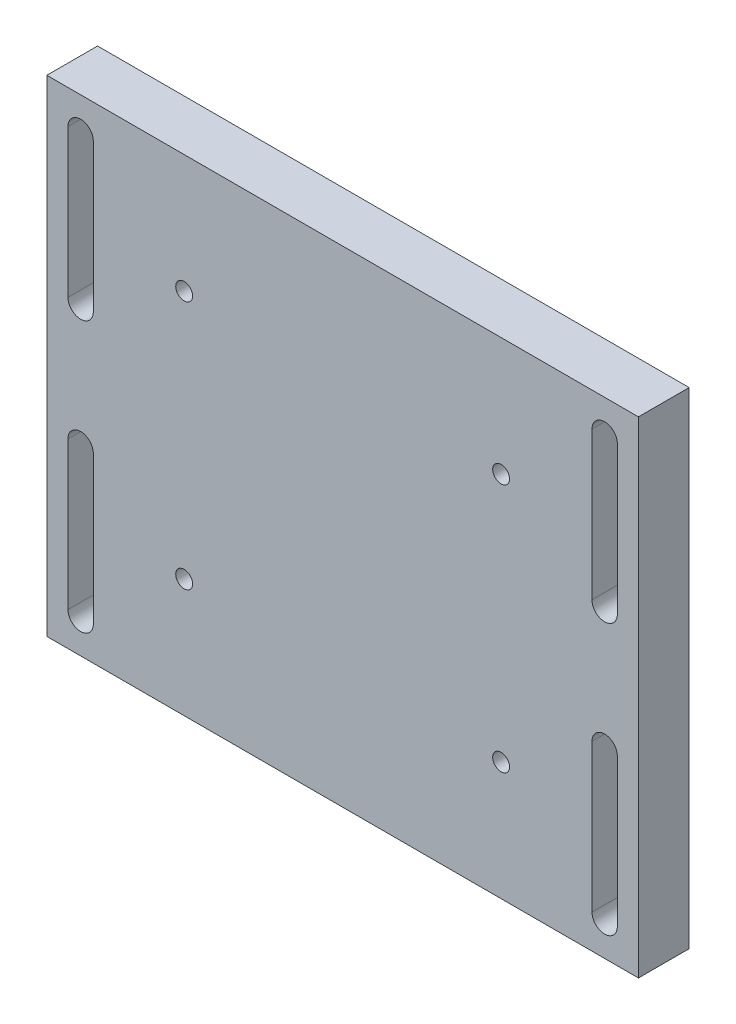
ISO-10303-21;
HEADER;
FILE_DESCRIPTION(('STEP AP214'),'2;1');
FILE_NAME('part.step','',(''),(''),'','','');
FILE_SCHEMA(('AUTOMOTIVE_DESIGN { 1 0 10303 214 1 1 1 1 }'));
ENDSEC;
DATA;
#1=APPLICATION_CONTEXT('core data for automotive mechanical design processes');
#2=APPLICATION_PROTOCOL_DEFINITION('international standard','automotive_design',2000,#1);
#3=PRODUCT_CONTEXT('',#1,'mechanical');
#4=PRODUCT('Part','Part','',(#3));
#5=PRODUCT_RELATED_PRODUCT_CATEGORY('part','',(#4));
#6=PRODUCT_DEFINITION_FORMATION('','',#4);
#7=PRODUCT_DEFINITION_CONTEXT('part definition',#1,'design');
#8=PRODUCT_DEFINITION('design','',#6,#7);
#9=PRODUCT_DEFINITION_SHAPE('','',#8);
#10=(LENGTH_UNIT() NAMED_UNIT(*) SI_UNIT(.MILLI.,.METRE.));
#11=(NAMED_UNIT(*) PLANE_ANGLE_UNIT() SI_UNIT($,.RADIAN.));
#12=(NAMED_UNIT(*) SI_UNIT($,.STERADIAN.) SOLID_ANGLE_UNIT());
#13=UNCERTAINTY_MEASURE_WITH_UNIT(LENGTH_MEASURE(1.E-05),#10,'distance_accuracy_value','');
#14=(GEOMETRIC_REPRESENTATION_CONTEXT(3) GLOBAL_UNCERTAINTY_ASSIGNED_CONTEXT((#13)) GLOBAL_UNIT_ASSIGNED_CONTEXT((#10,
#11,#12)) REPRESENTATION_CONTEXT('',''));
#15=CARTESIAN_POINT('',(0.,0.,0.));
#16=DIRECTION('',(0.,0.,1.));
#17=DIRECTION('',(1.,0.,0.));
#18=AXIS2_PLACEMENT_3D('',#15,#16,#17);
#19=CARTESIAN_POINT('',(70.,57.5,6.));
#20=DIRECTION('',(-1.,0.,0.));
#21=DIRECTION('',(0.,-1.,0.));
#22=AXIS2_PLACEMENT_3D('',#19,#20,#21);
#23=PLANE('',#22);
#24=DIRECTION('',(0.,1.,0.));
#25=VECTOR('',#24,1.);
#26=CARTESIAN_POINT('',(70.,57.5,-6.));
#27=LINE('',#26,#25);
#28=CARTESIAN_POINT('',(70.,-57.5,-6.));
#29=VERTEX_POINT('',#28);
#30=CARTESIAN_POINT('',(70.,57.5,-6.));
#31=VERTEX_POINT('',#30);
#32=EDGE_CURVE('E311',#29,#31,#27,.T.);
#33=ORIENTED_EDGE('',*,*,#32,.T.);
#34=DIRECTION('',(0.,0.,-1.));
#35=VECTOR('',#34,1.);
#36=CARTESIAN_POINT('',(70.,57.5,6.));
#37=LINE('',#36,#35);
#38=CARTESIAN_POINT('',(70.,57.5,6.));
#39=VERTEX_POINT('',#38);
#40=EDGE_CURVE('E11',#39,#31,#37,.T.);
#41=ORIENTED_EDGE('',*,*,#40,.F.);
#42=DIRECTION('',(0.,1.,0.));
#43=VECTOR('',#42,1.);
#44=CARTESIAN_POINT('',(70.,57.5,6.));
#45=LINE('',#44,#43);
#46=CARTESIAN_POINT('',(70.,-57.5,6.));
#47=VERTEX_POINT('',#46);
#48=EDGE_CURVE('E312',#47,#39,#45,.T.);
#49=ORIENTED_EDGE('',*,*,#48,.F.);
#50=DIRECTION('',(0.,0.,-1.));
#51=VECTOR('',#50,1.);
#52=CARTESIAN_POINT('',(70.,-57.5,6.));
#53=LINE('',#52,#51);
#54=EDGE_CURVE('E322',#47,#29,#53,.T.);
#55=ORIENTED_EDGE('',*,*,#54,.T.);
#56=EDGE_LOOP('',(#33,#41,#49,#55));
#57=FACE_BOUND('',#56,.T.);
#58=ADVANCED_FACE('F33',(#57),#23,.F.);
#59=CARTESIAN_POINT('',(-70.,57.5,6.));
#60=DIRECTION('',(0.,-1.,0.));
#61=DIRECTION('',(0.,0.,-1.));
#62=AXIS2_PLACEMENT_3D('',#59,#60,#61);
#63=PLANE('',#62);
#64=DIRECTION('',(-1.,0.,0.));
#65=VECTOR('',#64,1.);
#66=CARTESIAN_POINT('',(-70.,57.5,-6.));
#67=LINE('',#66,#65);
#68=CARTESIAN_POINT('',(-70.,57.5,-6.));
#69=VERTEX_POINT('',#68);
#70=EDGE_CURVE('E325',#31,#69,#67,.T.);
#71=ORIENTED_EDGE('',*,*,#70,.T.);
#72=DIRECTION('',(0.,0.,-1.));
#73=VECTOR('',#72,1.);
#74=CARTESIAN_POINT('',(-70.,57.5,6.));
#75=LINE('',#74,#73);
#76=CARTESIAN_POINT('',(-70.,57.5,6.));
#77=VERTEX_POINT('',#76);
#78=EDGE_CURVE('E40',#77,#69,#75,.T.);
#79=ORIENTED_EDGE('',*,*,#78,.F.);
#80=DIRECTION('',(-1.,0.,0.));
#81=VECTOR('',#80,1.);
#82=CARTESIAN_POINT('',(-70.,57.5,6.));
#83=LINE('',#82,#81);
#84=EDGE_CURVE('E315',#39,#77,#83,.T.);
#85=ORIENTED_EDGE('',*,*,#84,.F.);
#86=ORIENTED_EDGE('',*,*,#40,.T.);
#87=EDGE_LOOP('',(#71,#79,#85,#86));
#88=FACE_BOUND('',#87,.T.);
#89=ADVANCED_FACE('F354',(#88),#63,.F.);
#90=CARTESIAN_POINT('',(-70.,57.5,6.));
#91=DIRECTION('',(1.,0.,0.));
#92=DIRECTION('',(0.,1.,0.));
#93=AXIS2_PLACEMENT_3D('',#90,#91,#92);
#94=PLANE('',#93);
#95=DIRECTION('',(0.,-1.,0.));
#96=VECTOR('',#95,1.);
#97=CARTESIAN_POINT('',(-70.,57.5,-6.));
#98=LINE('',#97,#96);
#99=CARTESIAN_POINT('',(-70.,-57.5,-6.));
#100=VERTEX_POINT('',#99);
#101=EDGE_CURVE('E327',#69,#100,#98,.T.);
#102=ORIENTED_EDGE('',*,*,#101,.T.);
#103=DIRECTION('',(0.,0.,-1.));
#104=VECTOR('',#103,1.);
#105=CARTESIAN_POINT('',(-70.,-57.5,6.));
#106=LINE('',#105,#104);
#107=CARTESIAN_POINT('',(-70.,-57.5,6.));
#108=VERTEX_POINT('',#107);
#109=EDGE_CURVE('E332',#108,#100,#106,.T.);
#110=ORIENTED_EDGE('',*,*,#109,.F.);
#111=DIRECTION('',(0.,-1.,0.));
#112=VECTOR('',#111,1.);
#113=CARTESIAN_POINT('',(-70.,57.5,6.));
#114=LINE('',#113,#112);
#115=EDGE_CURVE('E318',#77,#108,#114,.T.);
#116=ORIENTED_EDGE('',*,*,#115,.F.);
#117=ORIENTED_EDGE('',*,*,#78,.T.);
#118=EDGE_LOOP('',(#102,#110,#116,#117));
#119=FACE_BOUND('',#118,.T.);
#120=ADVANCED_FACE('F339',(#119),#94,.F.);
#121=CARTESIAN_POINT('',(-70.,-57.5,6.));
#122=DIRECTION('',(0.,1.,0.));
#123=DIRECTION('',(0.,0.,1.));
#124=AXIS2_PLACEMENT_3D('',#121,#122,#123);
#125=PLANE('',#124);
#126=DIRECTION('',(1.,0.,0.));
#127=VECTOR('',#126,1.);
#128=CARTESIAN_POINT('',(-70.,-57.5,-6.));
#129=LINE('',#128,#127);
#130=EDGE_CURVE('E316',#100,#29,#129,.T.);
#131=ORIENTED_EDGE('',*,*,#130,.T.);
#132=ORIENTED_EDGE('',*,*,#54,.F.);
#133=DIRECTION('',(1.,0.,0.));
#134=VECTOR('',#133,1.);
#135=CARTESIAN_POINT('',(-70.,-57.5,6.));
#136=LINE('',#135,#134);
#137=EDGE_CURVE('E320',#108,#47,#136,.T.);
#138=ORIENTED_EDGE('',*,*,#137,.F.);
#139=ORIENTED_EDGE('',*,*,#109,.T.);
#140=EDGE_LOOP('',(#131,#132,#138,#139));
#141=FACE_BOUND('',#140,.T.);
#142=ADVANCED_FACE('F348',(#141),#125,.F.);
#143=CARTESIAN_POINT('',(0.,0.,6.));
#144=DIRECTION('',(0.,0.,1.));
#145=DIRECTION('',(1.,0.,0.));
#146=AXIS2_PLACEMENT_3D('',#143,#144,#145);
#147=PLANE('',#146);
#148=CARTESIAN_POINT('',(-37.5,29.5,6.));
#149=DIRECTION('',(0.,0.,-1.));
#150=DIRECTION('',(-1.,0.,0.));
#151=AXIS2_PLACEMENT_3D('',#148,#149,#150);
#152=CIRCLE('',#151,2.);
#153=CARTESIAN_POINT('',(-39.5,29.5,6.));
#154=VERTEX_POINT('',#153);
#155=EDGE_CURVE('E451',#154,#154,#152,.T.);
#156=ORIENTED_EDGE('',*,*,#155,.T.);
#157=EDGE_LOOP('',(#156));
#158=FACE_BOUND('',#157,.T.);
#159=CARTESIAN_POINT('',(-62.,14.5,6.));
#160=DIRECTION('',(0.,0.,-1.));
#161=DIRECTION('',(-1.,0.,0.));
#162=AXIS2_PLACEMENT_3D('',#159,#160,#161);
#163=CIRCLE('',#162,3.00000000000001);
#164=CARTESIAN_POINT('',(-59.,14.5,6.));
#165=VERTEX_POINT('',#164);
#166=CARTESIAN_POINT('',(-65.0000000000001,14.5,6.));
#167=VERTEX_POINT('',#166);
#168=EDGE_CURVE('E189',#165,#167,#163,.T.);
#169=ORIENTED_EDGE('',*,*,#168,.T.);
#170=DIRECTION('',(0.,1.,0.));
#171=VECTOR('',#170,1.);
#172=CARTESIAN_POINT('',(-65.0000000000001,49.5,6.));
#173=LINE('',#172,#171);
#174=CARTESIAN_POINT('',(-65.0000000000001,49.5,6.));
#175=VERTEX_POINT('',#174);
#176=EDGE_CURVE('E172',#167,#175,#173,.T.);
#177=ORIENTED_EDGE('',*,*,#176,.T.);
#178=CARTESIAN_POINT('',(-62.,49.5,6.));
#179=DIRECTION('',(0.,0.,-1.));
#180=DIRECTION('',(-1.,0.,0.));
#181=AXIS2_PLACEMENT_3D('',#178,#179,#180);
#182=CIRCLE('',#181,3.00000000000001);
#183=CARTESIAN_POINT('',(-59.,49.5,6.));
#184=VERTEX_POINT('',#183);
#185=EDGE_CURVE('E180',#175,#184,#182,.T.);
#186=ORIENTED_EDGE('',*,*,#185,.T.);
#187=DIRECTION('',(0.,-1.,0.));
#188=VECTOR('',#187,1.);
#189=CARTESIAN_POINT('',(-59.,14.5,6.));
#190=LINE('',#189,#188);
#191=EDGE_CURVE('E47',#184,#165,#190,.T.);
#192=ORIENTED_EDGE('',*,*,#191,.T.);
#193=EDGE_LOOP('',(#169,#177,#186,#192));
#194=FACE_BOUND('',#193,.T.);
#195=CARTESIAN_POINT('',(-37.5,-29.5,6.));
#196=DIRECTION('',(0.,0.,1.));
#197=DIRECTION('',(-1.,0.,0.));
#198=AXIS2_PLACEMENT_3D('',#195,#196,#197);
#199=CIRCLE('',#198,2.);
#200=CARTESIAN_POINT('',(-39.5,-29.5,6.));
#201=VERTEX_POINT('',#200);
#202=EDGE_CURVE('E201',#201,#201,#199,.T.);
#203=ORIENTED_EDGE('',*,*,#202,.F.);
#204=EDGE_LOOP('',(#203));
#205=FACE_BOUND('',#204,.T.);
#206=CARTESIAN_POINT('',(-62.,-49.5,6.));
#207=DIRECTION('',(0.,0.,1.));
#208=DIRECTION('',(-1.,0.,0.));
#209=AXIS2_PLACEMENT_3D('',#206,#207,#208);
#210=CIRCLE('',#209,3.00000000000001);
#211=CARTESIAN_POINT('',(-65.0000000000001,-49.5,6.));
#212=VERTEX_POINT('',#211);
#213=CARTESIAN_POINT('',(-59.,-49.5,6.));
#214=VERTEX_POINT('',#213);
#215=EDGE_CURVE('E208',#212,#214,#210,.T.);
#216=ORIENTED_EDGE('',*,*,#215,.F.);
#217=DIRECTION('',(0.,-1.,0.));
#218=VECTOR('',#217,1.);
#219=CARTESIAN_POINT('',(-65.0000000000001,-49.5,6.));
#220=LINE('',#219,#218);
#221=CARTESIAN_POINT('',(-65.0000000000001,-14.5,6.));
#222=VERTEX_POINT('',#221);
#223=EDGE_CURVE('E225',#222,#212,#220,.T.);
#224=ORIENTED_EDGE('',*,*,#223,.F.);
#225=CARTESIAN_POINT('',(-62.,-14.5,6.));
#226=DIRECTION('',(0.,0.,1.));
#227=DIRECTION('',(-1.,0.,0.));
#228=AXIS2_PLACEMENT_3D('',#225,#226,#227);
#229=CIRCLE('',#228,3.00000000000001);
#230=CARTESIAN_POINT('',(-59.,-14.5,6.));
#231=VERTEX_POINT('',#230);
#232=EDGE_CURVE('E222',#231,#222,#229,.T.);
#233=ORIENTED_EDGE('',*,*,#232,.F.);
#234=DIRECTION('',(0.,1.,0.));
#235=VECTOR('',#234,1.);
#236=CARTESIAN_POINT('',(-59.,-14.5,6.));
#237=LINE('',#236,#235);
#238=EDGE_CURVE('E219',#214,#231,#237,.T.);
#239=ORIENTED_EDGE('',*,*,#238,.F.);
#240=EDGE_LOOP('',(#216,#224,#233,#239));
#241=FACE_BOUND('',#240,.T.);
#242=CARTESIAN_POINT('',(37.5,-29.5,6.));
#243=DIRECTION('',(0.,0.,-1.));
#244=DIRECTION('',(1.,0.,0.));
#245=AXIS2_PLACEMENT_3D('',#242,#243,#244);
#246=CIRCLE('',#245,2.);
#247=CARTESIAN_POINT('',(39.5,-29.5,6.));
#248=VERTEX_POINT('',#247);
#249=EDGE_CURVE('E237',#248,#248,#246,.T.);
#250=ORIENTED_EDGE('',*,*,#249,.T.);
#251=EDGE_LOOP('',(#250));
#252=FACE_BOUND('',#251,.T.);
#253=CARTESIAN_POINT('',(62.,-14.5,6.));
#254=DIRECTION('',(0.,0.,-1.));
#255=DIRECTION('',(1.,0.,0.));
#256=AXIS2_PLACEMENT_3D('',#253,#254,#255);
#257=CIRCLE('',#256,3.00000000000001);
#258=CARTESIAN_POINT('',(59.,-14.5,6.));
#259=VERTEX_POINT('',#258);
#260=CARTESIAN_POINT('',(65.0000000000001,-14.5,6.));
#261=VERTEX_POINT('',#260);
#262=EDGE_CURVE('E260',#259,#261,#257,.T.);
#263=ORIENTED_EDGE('',*,*,#262,.T.);
#264=DIRECTION('',(0.,-1.,0.));
#265=VECTOR('',#264,1.);
#266=CARTESIAN_POINT('',(65.0000000000001,-49.5,6.));
#267=LINE('',#266,#265);
#268=CARTESIAN_POINT('',(65.0000000000001,-49.5,6.));
#269=VERTEX_POINT('',#268);
#270=EDGE_CURVE('E257',#261,#269,#267,.T.);
#271=ORIENTED_EDGE('',*,*,#270,.T.);
#272=CARTESIAN_POINT('',(62.,-49.5,6.));
#273=DIRECTION('',(0.,0.,-1.));
#274=DIRECTION('',(1.,0.,0.));
#275=AXIS2_PLACEMENT_3D('',#272,#273,#274);
#276=CIRCLE('',#275,3.00000000000001);
#277=CARTESIAN_POINT('',(59.,-49.5,6.));
#278=VERTEX_POINT('',#277);
#279=EDGE_CURVE('E243',#269,#278,#276,.T.);
#280=ORIENTED_EDGE('',*,*,#279,.T.);
#281=DIRECTION('',(0.,1.,0.));
#282=VECTOR('',#281,1.);
#283=CARTESIAN_POINT('',(59.,-14.5,6.));
#284=LINE('',#283,#282);
#285=EDGE_CURVE('E263',#278,#259,#284,.T.);
#286=ORIENTED_EDGE('',*,*,#285,.T.);
#287=EDGE_LOOP('',(#263,#271,#280,#286));
#288=FACE_BOUND('',#287,.T.);
#289=CARTESIAN_POINT('',(37.5,29.5,6.));
#290=DIRECTION('',(0.,0.,1.));
#291=DIRECTION('',(1.,0.,0.));
#292=AXIS2_PLACEMENT_3D('',#289,#290,#291);
#293=CIRCLE('',#292,2.);
#294=CARTESIAN_POINT('',(39.5,29.5,6.));
#295=VERTEX_POINT('',#294);
#296=EDGE_CURVE('E254',#295,#295,#293,.T.);
#297=ORIENTED_EDGE('',*,*,#296,.F.);
#298=EDGE_LOOP('',(#297));
#299=FACE_BOUND('',#298,.T.);
#300=CARTESIAN_POINT('',(62.,49.5,6.));
#301=DIRECTION('',(0.,0.,1.));
#302=DIRECTION('',(1.,0.,0.));
#303=AXIS2_PLACEMENT_3D('',#300,#301,#302);
#304=CIRCLE('',#303,3.00000000000001);
#305=CARTESIAN_POINT('',(65.0000000000001,49.5,6.));
#306=VERTEX_POINT('',#305);
#307=CARTESIAN_POINT('',(59.,49.5,6.));
#308=VERTEX_POINT('',#307);
#309=EDGE_CURVE('E282',#306,#308,#304,.T.);
#310=ORIENTED_EDGE('',*,*,#309,.F.);
#311=DIRECTION('',(0.,1.,0.));
#312=VECTOR('',#311,1.);
#313=CARTESIAN_POINT('',(65.0000000000001,49.5,6.));
#314=LINE('',#313,#312);
#315=CARTESIAN_POINT('',(65.0000000000001,14.5,6.));
#316=VERTEX_POINT('',#315);
#317=EDGE_CURVE('E299',#316,#306,#314,.T.);
#318=ORIENTED_EDGE('',*,*,#317,.F.);
#319=CARTESIAN_POINT('',(62.,14.5,6.));
#320=DIRECTION('',(0.,0.,1.));
#321=DIRECTION('',(1.,0.,0.));
#322=AXIS2_PLACEMENT_3D('',#319,#320,#321);
#323=CIRCLE('',#322,3.00000000000001);
#324=CARTESIAN_POINT('',(59.,14.5,6.));
#325=VERTEX_POINT('',#324);
#326=EDGE_CURVE('E296',#325,#316,#323,.T.);
#327=ORIENTED_EDGE('',*,*,#326,.F.);
#328=DIRECTION('',(0.,-1.,0.));
#329=VECTOR('',#328,1.);
#330=CARTESIAN_POINT('',(59.,14.5,6.));
#331=LINE('',#330,#329);
#332=EDGE_CURVE('E293',#308,#325,#331,.T.);
#333=ORIENTED_EDGE('',*,*,#332,.F.);
#334=EDGE_LOOP('',(#310,#318,#327,#333));
#335=FACE_BOUND('',#334,.T.);
#336=ORIENTED_EDGE('',*,*,#48,.T.);
#337=ORIENTED_EDGE('',*,*,#84,.T.);
#338=ORIENTED_EDGE('',*,*,#115,.T.);
#339=ORIENTED_EDGE('',*,*,#137,.T.);
#340=EDGE_LOOP('',(#336,#337,#338,#339));
#341=FACE_BOUND('',#340,.T.);
#342=ADVANCED_FACE('F186',(#158,#194,#205,#241,#252,#288,#299,#335,#341),#147,.T.);
#343=CARTESIAN_POINT('',(0.,0.,-6.));
#344=DIRECTION('',(0.,0.,1.));
#345=DIRECTION('',(1.,0.,0.));
#346=AXIS2_PLACEMENT_3D('',#343,#344,#345);
#347=PLANE('',#346);
#348=CARTESIAN_POINT('',(-37.5,29.5,-6.));
#349=DIRECTION('',(0.,0.,1.));
#350=DIRECTION('',(1.,0.,0.));
#351=AXIS2_PLACEMENT_3D('',#348,#349,#350);
#352=CIRCLE('',#351,2.);
#353=CARTESIAN_POINT('',(-35.5,29.5,-6.));
#354=VERTEX_POINT('',#353);
#355=EDGE_CURVE('E184',#354,#354,#352,.T.);
#356=ORIENTED_EDGE('',*,*,#355,.T.);
#357=EDGE_LOOP('',(#356));
#358=FACE_BOUND('',#357,.T.);
#359=DIRECTION('',(0.,-1.,0.));
#360=VECTOR('',#359,1.);
#361=CARTESIAN_POINT('',(-65.0000000000001,49.5,-6.));
#362=LINE('',#361,#360);
#363=CARTESIAN_POINT('',(-65.0000000000001,49.5,-6.));
#364=VERTEX_POINT('',#363);
#365=CARTESIAN_POINT('',(-65.0000000000001,14.5,-6.));
#366=VERTEX_POINT('',#365);
#367=EDGE_CURVE('E175',#364,#366,#362,.T.);
#368=ORIENTED_EDGE('',*,*,#367,.T.);
#369=CARTESIAN_POINT('',(-62.,14.5,-6.));
#370=DIRECTION('',(0.,0.,1.));
#371=DIRECTION('',(1.,0.,0.));
#372=AXIS2_PLACEMENT_3D('',#369,#370,#371);
#373=CIRCLE('',#372,3.00000000000001);
#374=CARTESIAN_POINT('',(-59.,14.5,-6.));
#375=VERTEX_POINT('',#374);
#376=EDGE_CURVE('E200',#366,#375,#373,.T.);
#377=ORIENTED_EDGE('',*,*,#376,.T.);
#378=DIRECTION('',(0.,1.,0.));
#379=VECTOR('',#378,1.);
#380=CARTESIAN_POINT('',(-59.,14.5,-6.));
#381=LINE('',#380,#379);
#382=CARTESIAN_POINT('',(-59.,49.5,-6.));
#383=VERTEX_POINT('',#382);
#384=EDGE_CURVE('E457',#375,#383,#381,.T.);
#385=ORIENTED_EDGE('',*,*,#384,.T.);
#386=CARTESIAN_POINT('',(-62.,49.5,-6.));
#387=DIRECTION('',(0.,0.,1.));
#388=DIRECTION('',(1.,0.,0.));
#389=AXIS2_PLACEMENT_3D('',#386,#387,#388);
#390=CIRCLE('',#389,3.00000000000001);
#391=EDGE_CURVE('E205',#383,#364,#390,.T.);
#392=ORIENTED_EDGE('',*,*,#391,.T.);
#393=EDGE_LOOP('',(#368,#377,#385,#392));
#394=FACE_BOUND('',#393,.T.);
#395=CARTESIAN_POINT('',(-37.5,-29.5,-6.));
#396=DIRECTION('',(0.,0.,1.));
#397=DIRECTION('',(1.,0.,0.));
#398=AXIS2_PLACEMENT_3D('',#395,#396,#397);
#399=CIRCLE('',#398,2.);
#400=CARTESIAN_POINT('',(-35.5,-29.5,-6.));
#401=VERTEX_POINT('',#400);
#402=EDGE_CURVE('E204',#401,#401,#399,.F.);
#403=ORIENTED_EDGE('',*,*,#402,.F.);
#404=EDGE_LOOP('',(#403));
#405=FACE_BOUND('',#404,.T.);
#406=DIRECTION('',(0.,1.,0.));
#407=VECTOR('',#406,1.);
#408=CARTESIAN_POINT('',(-65.0000000000001,-49.5,-6.));
#409=LINE('',#408,#407);
#410=CARTESIAN_POINT('',(-65.0000000000001,-49.5,-6.));
#411=VERTEX_POINT('',#410);
#412=CARTESIAN_POINT('',(-65.0000000000001,-14.5,-6.));
#413=VERTEX_POINT('',#412);
#414=EDGE_CURVE('E212',#411,#413,#409,.T.);
#415=ORIENTED_EDGE('',*,*,#414,.F.);
#416=CARTESIAN_POINT('',(-62.,-49.5,-6.));
#417=DIRECTION('',(0.,0.,1.));
#418=DIRECTION('',(1.,0.,0.));
#419=AXIS2_PLACEMENT_3D('',#416,#417,#418);
#420=CIRCLE('',#419,3.00000000000001);
#421=CARTESIAN_POINT('',(-59.,-49.5,-6.));
#422=VERTEX_POINT('',#421);
#423=EDGE_CURVE('E215',#422,#411,#420,.F.);
#424=ORIENTED_EDGE('',*,*,#423,.F.);
#425=DIRECTION('',(0.,-1.,0.));
#426=VECTOR('',#425,1.);
#427=CARTESIAN_POINT('',(-59.,-14.5,-6.));
#428=LINE('',#427,#426);
#429=CARTESIAN_POINT('',(-59.,-14.5,-6.));
#430=VERTEX_POINT('',#429);
#431=EDGE_CURVE('E217',#430,#422,#428,.T.);
#432=ORIENTED_EDGE('',*,*,#431,.F.);
#433=CARTESIAN_POINT('',(-62.,-14.5,-6.));
#434=DIRECTION('',(0.,0.,1.));
#435=DIRECTION('',(1.,0.,0.));
#436=AXIS2_PLACEMENT_3D('',#433,#434,#435);
#437=CIRCLE('',#436,3.00000000000001);
#438=EDGE_CURVE('E209',#413,#430,#437,.F.);
#439=ORIENTED_EDGE('',*,*,#438,.F.);
#440=EDGE_LOOP('',(#415,#424,#432,#439));
#441=FACE_BOUND('',#440,.T.);
#442=CARTESIAN_POINT('',(37.5,-29.5,-6.));
#443=DIRECTION('',(0.,0.,1.));
#444=DIRECTION('',(1.,0.,0.));
#445=AXIS2_PLACEMENT_3D('',#442,#443,#444);
#446=CIRCLE('',#445,2.);
#447=CARTESIAN_POINT('',(39.5,-29.5,-6.));
#448=VERTEX_POINT('',#447);
#449=EDGE_CURVE('E240',#448,#448,#446,.T.);
#450=ORIENTED_EDGE('',*,*,#449,.T.);
#451=EDGE_LOOP('',(#450));
#452=FACE_BOUND('',#451,.T.);
#453=DIRECTION('',(0.,1.,0.));
#454=VECTOR('',#453,1.);
#455=CARTESIAN_POINT('',(65.0000000000001,-49.5,-6.));
#456=LINE('',#455,#454);
#457=CARTESIAN_POINT('',(65.0000000000001,-49.5,-6.));
#458=VERTEX_POINT('',#457);
#459=CARTESIAN_POINT('',(65.0000000000001,-14.5,-6.));
#460=VERTEX_POINT('',#459);
#461=EDGE_CURVE('E248',#458,#460,#456,.T.);
#462=ORIENTED_EDGE('',*,*,#461,.T.);
#463=CARTESIAN_POINT('',(62.,-14.5,-6.));
#464=DIRECTION('',(0.,0.,1.));
#465=DIRECTION('',(1.,0.,0.));
#466=AXIS2_PLACEMENT_3D('',#463,#464,#465);
#467=CIRCLE('',#466,3.00000000000001);
#468=CARTESIAN_POINT('',(59.,-14.5,-6.));
#469=VERTEX_POINT('',#468);
#470=EDGE_CURVE('E244',#460,#469,#467,.T.);
#471=ORIENTED_EDGE('',*,*,#470,.T.);
#472=DIRECTION('',(0.,-1.,0.));
#473=VECTOR('',#472,1.);
#474=CARTESIAN_POINT('',(59.,-14.5,-6.));
#475=LINE('',#474,#473);
#476=CARTESIAN_POINT('',(59.,-49.5,-6.));
#477=VERTEX_POINT('',#476);
#478=EDGE_CURVE('E247',#469,#477,#475,.T.);
#479=ORIENTED_EDGE('',*,*,#478,.T.);
#480=CARTESIAN_POINT('',(62.,-49.5,-6.));
#481=DIRECTION('',(0.,0.,1.));
#482=DIRECTION('',(1.,0.,0.));
#483=AXIS2_PLACEMENT_3D('',#480,#481,#482);
#484=CIRCLE('',#483,3.00000000000001);
#485=EDGE_CURVE('E251',#477,#458,#484,.T.);
#486=ORIENTED_EDGE('',*,*,#485,.T.);
#487=EDGE_LOOP('',(#462,#471,#479,#486));
#488=FACE_BOUND('',#487,.T.);
#489=CARTESIAN_POINT('',(37.5,29.5,-6.));
#490=DIRECTION('',(0.,0.,1.));
#491=DIRECTION('',(1.,0.,0.));
#492=AXIS2_PLACEMENT_3D('',#489,#490,#491);
#493=CIRCLE('',#492,2.);
#494=CARTESIAN_POINT('',(39.5,29.5,-6.));
#495=VERTEX_POINT('',#494);
#496=EDGE_CURVE('E279',#495,#495,#493,.F.);
#497=ORIENTED_EDGE('',*,*,#496,.F.);
#498=EDGE_LOOP('',(#497));
#499=FACE_BOUND('',#498,.T.);
#500=DIRECTION('',(0.,-1.,0.));
#501=VECTOR('',#500,1.);
#502=CARTESIAN_POINT('',(65.0000000000001,49.5,-6.));
#503=LINE('',#502,#501);
#504=CARTESIAN_POINT('',(65.0000000000001,49.5,-6.));
#505=VERTEX_POINT('',#504);
#506=CARTESIAN_POINT('',(65.0000000000001,14.5,-6.));
#507=VERTEX_POINT('',#506);
#508=EDGE_CURVE('E286',#505,#507,#503,.T.);
#509=ORIENTED_EDGE('',*,*,#508,.F.);
#510=CARTESIAN_POINT('',(62.,49.5,-6.));
#511=DIRECTION('',(0.,0.,1.));
#512=DIRECTION('',(1.,0.,0.));
#513=AXIS2_PLACEMENT_3D('',#510,#511,#512);
#514=CIRCLE('',#513,3.00000000000001);
#515=CARTESIAN_POINT('',(59.,49.5,-6.));
#516=VERTEX_POINT('',#515);
#517=EDGE_CURVE('E289',#516,#505,#514,.F.);
#518=ORIENTED_EDGE('',*,*,#517,.F.);
#519=DIRECTION('',(0.,1.,0.));
#520=VECTOR('',#519,1.);
#521=CARTESIAN_POINT('',(59.,14.5,-6.));
#522=LINE('',#521,#520);
#523=CARTESIAN_POINT('',(59.,14.5,-6.));
#524=VERTEX_POINT('',#523);
#525=EDGE_CURVE('E291',#524,#516,#522,.T.);
#526=ORIENTED_EDGE('',*,*,#525,.F.);
#527=CARTESIAN_POINT('',(62.,14.5,-6.));
#528=DIRECTION('',(0.,0.,1.));
#529=DIRECTION('',(1.,0.,0.));
#530=AXIS2_PLACEMENT_3D('',#527,#528,#529);
#531=CIRCLE('',#530,3.00000000000001);
#532=EDGE_CURVE('E283',#507,#524,#531,.F.);
#533=ORIENTED_EDGE('',*,*,#532,.F.);
#534=EDGE_LOOP('',(#509,#518,#526,#533));
#535=FACE_BOUND('',#534,.T.);
#536=ORIENTED_EDGE('',*,*,#32,.F.);
#537=ORIENTED_EDGE('',*,*,#130,.F.);
#538=ORIENTED_EDGE('',*,*,#101,.F.);
#539=ORIENTED_EDGE('',*,*,#70,.F.);
#540=EDGE_LOOP('',(#536,#537,#538,#539));
#541=FACE_BOUND('',#540,.T.);
#542=ADVANCED_FACE('F345',(#358,#394,#405,#441,#452,#488,#499,#535,#541),#347,.F.);
#543=CARTESIAN_POINT('',(62.,49.5,-47.4366987102013));
#544=DIRECTION('',(0.,0.,1.));
#545=DIRECTION('',(1.,0.,0.));
#546=AXIS2_PLACEMENT_3D('',#543,#544,#545);
#547=CYLINDRICAL_SURFACE('',#546,3.00000000000001);
#548=ORIENTED_EDGE('',*,*,#517,.T.);
#549=DIRECTION('',(0.,0.,1.));
#550=VECTOR('',#549,1.);
#551=CARTESIAN_POINT('',(65.0000000000001,49.5,-47.4366987102013));
#552=LINE('',#551,#550);
#553=EDGE_CURVE('E287',#505,#306,#552,.T.);
#554=ORIENTED_EDGE('',*,*,#553,.T.);
#555=ORIENTED_EDGE('',*,*,#309,.T.);
#556=DIRECTION('',(0.,0.,1.));
#557=VECTOR('',#556,1.);
#558=CARTESIAN_POINT('',(59.,49.5,-47.4366987102013));
#559=LINE('',#558,#557);
#560=EDGE_CURVE('E302',#516,#308,#559,.T.);
#561=ORIENTED_EDGE('',*,*,#560,.F.);
#562=EDGE_LOOP('',(#548,#554,#555,#561));
#563=FACE_BOUND('',#562,.T.);
#564=ADVANCED_FACE('F366',(#563),#547,.F.);
#565=CARTESIAN_POINT('',(65.0000000000001,49.5,-47.4366987102013));
#566=DIRECTION('',(1.,0.,0.));
#567=DIRECTION('',(0.,0.,-1.));
#568=AXIS2_PLACEMENT_3D('',#565,#566,#567);
#569=PLANE('',#568);
#570=ORIENTED_EDGE('',*,*,#508,.T.);
#571=DIRECTION('',(0.,0.,1.));
#572=VECTOR('',#571,1.);
#573=CARTESIAN_POINT('',(65.0000000000001,14.5,-47.4366987102013));
#574=LINE('',#573,#572);
#575=EDGE_CURVE('E304',#507,#316,#574,.T.);
#576=ORIENTED_EDGE('',*,*,#575,.T.);
#577=ORIENTED_EDGE('',*,*,#317,.T.);
#578=ORIENTED_EDGE('',*,*,#553,.F.);
#579=EDGE_LOOP('',(#570,#576,#577,#578));
#580=FACE_BOUND('',#579,.T.);
#581=ADVANCED_FACE('F373',(#580),#569,.F.);
#582=CARTESIAN_POINT('',(62.,14.5,-47.4366987102013));
#583=DIRECTION('',(0.,0.,1.));
#584=DIRECTION('',(1.,0.,0.));
#585=AXIS2_PLACEMENT_3D('',#582,#583,#584);
#586=CYLINDRICAL_SURFACE('',#585,3.00000000000001);
#587=ORIENTED_EDGE('',*,*,#532,.T.);
#588=DIRECTION('',(0.,0.,1.));
#589=VECTOR('',#588,1.);
#590=CARTESIAN_POINT('',(59.,14.5,-47.4366987102013));
#591=LINE('',#590,#589);
#592=EDGE_CURVE('E306',#524,#325,#591,.T.);
#593=ORIENTED_EDGE('',*,*,#592,.T.);
#594=ORIENTED_EDGE('',*,*,#326,.T.);
#595=ORIENTED_EDGE('',*,*,#575,.F.);
#596=EDGE_LOOP('',(#587,#593,#594,#595));
#597=FACE_BOUND('',#596,.T.);
#598=ADVANCED_FACE('F379',(#597),#586,.F.);
#599=CARTESIAN_POINT('',(59.,14.5,-47.4366987102013));
#600=DIRECTION('',(-1.,0.,0.));
#601=DIRECTION('',(0.,0.,1.));
#602=AXIS2_PLACEMENT_3D('',#599,#600,#601);
#603=PLANE('',#602);
#604=ORIENTED_EDGE('',*,*,#525,.T.);
#605=ORIENTED_EDGE('',*,*,#560,.T.);
#606=ORIENTED_EDGE('',*,*,#332,.T.);
#607=ORIENTED_EDGE('',*,*,#592,.F.);
#608=EDGE_LOOP('',(#604,#605,#606,#607));
#609=FACE_BOUND('',#608,.T.);
#610=ADVANCED_FACE('F375',(#609),#603,.F.);
#611=CARTESIAN_POINT('',(37.5,29.5,-11.6568542494924));
#612=DIRECTION('',(0.,0.,1.));
#613=DIRECTION('',(1.,0.,0.));
#614=AXIS2_PLACEMENT_3D('',#611,#612,#613);
#615=CYLINDRICAL_SURFACE('',#614,2.);
#616=ORIENTED_EDGE('',*,*,#496,.T.);
#617=EDGE_LOOP('',(#616));
#618=FACE_BOUND('',#617,.T.);
#619=ORIENTED_EDGE('',*,*,#296,.T.);
#620=EDGE_LOOP('',(#619));
#621=FACE_BOUND('',#620,.T.);
#622=ADVANCED_FACE('F378',(#618,#621),#615,.F.);
#623=CARTESIAN_POINT('',(65.0000000000001,-49.5,-47.4366987102013));
#624=DIRECTION('',(-1.,0.,0.));
#625=DIRECTION('',(0.,0.,1.));
#626=AXIS2_PLACEMENT_3D('',#623,#624,#625);
#627=PLANE('',#626);
#628=DIRECTION('',(0.,0.,1.));
#629=VECTOR('',#628,1.);
#630=CARTESIAN_POINT('',(65.0000000000001,-49.5,-47.4366987102013));
#631=LINE('',#630,#629);
#632=EDGE_CURVE('E266',#458,#269,#631,.T.);
#633=ORIENTED_EDGE('',*,*,#632,.T.);
#634=ORIENTED_EDGE('',*,*,#270,.F.);
#635=DIRECTION('',(0.,0.,1.));
#636=VECTOR('',#635,1.);
#637=CARTESIAN_POINT('',(65.0000000000001,-14.5,-47.4366987102013));
#638=LINE('',#637,#636);
#639=EDGE_CURVE('E272',#460,#261,#638,.T.);
#640=ORIENTED_EDGE('',*,*,#639,.F.);
#641=ORIENTED_EDGE('',*,*,#461,.F.);
#642=EDGE_LOOP('',(#633,#634,#640,#641));
#643=FACE_BOUND('',#642,.T.);
#644=ADVANCED_FACE('F389',(#643),#627,.T.);
#645=CARTESIAN_POINT('',(62.,-14.5,-47.4366987102013));
#646=DIRECTION('',(0.,0.,1.));
#647=DIRECTION('',(1.,0.,0.));
#648=AXIS2_PLACEMENT_3D('',#645,#646,#647);
#649=CYLINDRICAL_SURFACE('',#648,3.00000000000001);
#650=ORIENTED_EDGE('',*,*,#639,.T.);
#651=ORIENTED_EDGE('',*,*,#262,.F.);
#652=DIRECTION('',(0.,0.,1.));
#653=VECTOR('',#652,1.);
#654=CARTESIAN_POINT('',(59.,-14.5,-47.4366987102013));
#655=LINE('',#654,#653);
#656=EDGE_CURVE('E270',#469,#259,#655,.T.);
#657=ORIENTED_EDGE('',*,*,#656,.F.);
#658=ORIENTED_EDGE('',*,*,#470,.F.);
#659=EDGE_LOOP('',(#650,#651,#657,#658));
#660=FACE_BOUND('',#659,.T.);
#661=ADVANCED_FACE('F399',(#660),#649,.F.);
#662=CARTESIAN_POINT('',(59.,-14.5,-47.4366987102013));
#663=DIRECTION('',(1.,0.,0.));
#664=DIRECTION('',(0.,0.,-1.));
#665=AXIS2_PLACEMENT_3D('',#662,#663,#664);
#666=PLANE('',#665);
#667=ORIENTED_EDGE('',*,*,#656,.T.);
#668=ORIENTED_EDGE('',*,*,#285,.F.);
#669=DIRECTION('',(0.,0.,1.));
#670=VECTOR('',#669,1.);
#671=CARTESIAN_POINT('',(59.,-49.5,-47.4366987102013));
#672=LINE('',#671,#670);
#673=EDGE_CURVE('E267',#477,#278,#672,.T.);
#674=ORIENTED_EDGE('',*,*,#673,.F.);
#675=ORIENTED_EDGE('',*,*,#478,.F.);
#676=EDGE_LOOP('',(#667,#668,#674,#675));
#677=FACE_BOUND('',#676,.T.);
#678=ADVANCED_FACE('F395',(#677),#666,.T.);
#679=CARTESIAN_POINT('',(62.,-49.5,-47.4366987102013));
#680=DIRECTION('',(0.,0.,1.));
#681=DIRECTION('',(1.,0.,0.));
#682=AXIS2_PLACEMENT_3D('',#679,#680,#681);
#683=CYLINDRICAL_SURFACE('',#682,3.00000000000001);
#684=ORIENTED_EDGE('',*,*,#673,.T.);
#685=ORIENTED_EDGE('',*,*,#279,.F.);
#686=ORIENTED_EDGE('',*,*,#632,.F.);
#687=ORIENTED_EDGE('',*,*,#485,.F.);
#688=EDGE_LOOP('',(#684,#685,#686,#687));
#689=FACE_BOUND('',#688,.T.);
#690=ADVANCED_FACE('F391',(#689),#683,.F.);
#691=CARTESIAN_POINT('',(37.5,-29.5,-11.6568542494924));
#692=DIRECTION('',(0.,0.,1.));
#693=DIRECTION('',(1.,0.,0.));
#694=AXIS2_PLACEMENT_3D('',#691,#692,#693);
#695=CYLINDRICAL_SURFACE('',#694,2.);
#696=ORIENTED_EDGE('',*,*,#449,.F.);
#697=EDGE_LOOP('',(#696));
#698=FACE_BOUND('',#697,.T.);
#699=ORIENTED_EDGE('',*,*,#249,.F.);
#700=EDGE_LOOP('',(#699));
#701=FACE_BOUND('',#700,.T.);
#702=ADVANCED_FACE('F394',(#698,#701),#695,.F.);
#703=CARTESIAN_POINT('',(-62.,-49.5,-47.4366987102013));
#704=DIRECTION('',(0.,0.,1.));
#705=DIRECTION('',(1.,0.,0.));
#706=AXIS2_PLACEMENT_3D('',#703,#704,#705);
#707=CYLINDRICAL_SURFACE('',#706,3.00000000000001);
#708=ORIENTED_EDGE('',*,*,#423,.T.);
#709=DIRECTION('',(0.,0.,1.));
#710=VECTOR('',#709,1.);
#711=CARTESIAN_POINT('',(-65.0000000000001,-49.5,-47.4366987102013));
#712=LINE('',#711,#710);
#713=EDGE_CURVE('E213',#411,#212,#712,.T.);
#714=ORIENTED_EDGE('',*,*,#713,.T.);
#715=ORIENTED_EDGE('',*,*,#215,.T.);
#716=DIRECTION('',(0.,0.,1.));
#717=VECTOR('',#716,1.);
#718=CARTESIAN_POINT('',(-59.,-49.5,-47.4366987102013));
#719=LINE('',#718,#717);
#720=EDGE_CURVE('E228',#422,#214,#719,.T.);
#721=ORIENTED_EDGE('',*,*,#720,.F.);
#722=EDGE_LOOP('',(#708,#714,#715,#721));
#723=FACE_BOUND('',#722,.T.);
#724=ADVANCED_FACE('F409',(#723),#707,.F.);
#725=CARTESIAN_POINT('',(-65.0000000000001,-49.5,-47.4366987102013));
#726=DIRECTION('',(-1.,0.,0.));
#727=DIRECTION('',(0.,0.,1.));
#728=AXIS2_PLACEMENT_3D('',#725,#726,#727);
#729=PLANE('',#728);
#730=ORIENTED_EDGE('',*,*,#414,.T.);
#731=DIRECTION('',(0.,0.,1.));
#732=VECTOR('',#731,1.);
#733=CARTESIAN_POINT('',(-65.0000000000001,-14.5,-47.4366987102013));
#734=LINE('',#733,#732);
#735=EDGE_CURVE('E230',#413,#222,#734,.T.);
#736=ORIENTED_EDGE('',*,*,#735,.T.);
#737=ORIENTED_EDGE('',*,*,#223,.T.);
#738=ORIENTED_EDGE('',*,*,#713,.F.);
#739=EDGE_LOOP('',(#730,#736,#737,#738));
#740=FACE_BOUND('',#739,.T.);
#741=ADVANCED_FACE('F413',(#740),#729,.F.);
#742=CARTESIAN_POINT('',(-62.,-14.5,-47.4366987102013));
#743=DIRECTION('',(0.,0.,1.));
#744=DIRECTION('',(1.,0.,0.));
#745=AXIS2_PLACEMENT_3D('',#742,#743,#744);
#746=CYLINDRICAL_SURFACE('',#745,3.00000000000001);
#747=ORIENTED_EDGE('',*,*,#438,.T.);
#748=DIRECTION('',(0.,0.,1.));
#749=VECTOR('',#748,1.);
#750=CARTESIAN_POINT('',(-59.,-14.5,-47.4366987102013));
#751=LINE('',#750,#749);
#752=EDGE_CURVE('E232',#430,#231,#751,.T.);
#753=ORIENTED_EDGE('',*,*,#752,.T.);
#754=ORIENTED_EDGE('',*,*,#232,.T.);
#755=ORIENTED_EDGE('',*,*,#735,.F.);
#756=EDGE_LOOP('',(#747,#753,#754,#755));
#757=FACE_BOUND('',#756,.T.);
#758=ADVANCED_FACE('F419',(#757),#746,.F.);
#759=CARTESIAN_POINT('',(-59.,-14.5,-47.4366987102013));
#760=DIRECTION('',(1.,0.,0.));
#761=DIRECTION('',(0.,0.,-1.));
#762=AXIS2_PLACEMENT_3D('',#759,#760,#761);
#763=PLANE('',#762);
#764=ORIENTED_EDGE('',*,*,#431,.T.);
#765=ORIENTED_EDGE('',*,*,#720,.T.);
#766=ORIENTED_EDGE('',*,*,#238,.T.);
#767=ORIENTED_EDGE('',*,*,#752,.F.);
#768=EDGE_LOOP('',(#764,#765,#766,#767));
#769=FACE_BOUND('',#768,.T.);
#770=ADVANCED_FACE('F415',(#769),#763,.F.);
#771=CARTESIAN_POINT('',(-37.5,-29.5,-11.6568542494924));
#772=DIRECTION('',(0.,0.,1.));
#773=DIRECTION('',(1.,0.,0.));
#774=AXIS2_PLACEMENT_3D('',#771,#772,#773);
#775=CYLINDRICAL_SURFACE('',#774,2.);
#776=ORIENTED_EDGE('',*,*,#402,.T.);
#777=EDGE_LOOP('',(#776));
#778=FACE_BOUND('',#777,.T.);
#779=ORIENTED_EDGE('',*,*,#202,.T.);
#780=EDGE_LOOP('',(#779));
#781=FACE_BOUND('',#780,.T.);
#782=ADVANCED_FACE('F418',(#778,#781),#775,.F.);
#783=CARTESIAN_POINT('',(-65.0000000000001,49.5,-47.4366987102013));
#784=DIRECTION('',(1.,0.,0.));
#785=DIRECTION('',(0.,0.,-1.));
#786=AXIS2_PLACEMENT_3D('',#783,#784,#785);
#787=PLANE('',#786);
#788=DIRECTION('',(0.,0.,1.));
#789=VECTOR('',#788,1.);
#790=CARTESIAN_POINT('',(-65.0000000000001,49.5,-47.4366987102013));
#791=LINE('',#790,#789);
#792=EDGE_CURVE('E55',#364,#175,#791,.T.);
#793=ORIENTED_EDGE('',*,*,#792,.T.);
#794=ORIENTED_EDGE('',*,*,#176,.F.);
#795=DIRECTION('',(0.,0.,1.));
#796=VECTOR('',#795,1.);
#797=CARTESIAN_POINT('',(-65.0000000000001,14.5,-47.4366987102013));
#798=LINE('',#797,#796);
#799=EDGE_CURVE('E177',#366,#167,#798,.T.);
#800=ORIENTED_EDGE('',*,*,#799,.F.);
#801=ORIENTED_EDGE('',*,*,#367,.F.);
#802=EDGE_LOOP('',(#793,#794,#800,#801));
#803=FACE_BOUND('',#802,.T.);
#804=ADVANCED_FACE('F169',(#803),#787,.T.);
#805=CARTESIAN_POINT('',(-62.,14.5,-47.4366987102013));
#806=DIRECTION('',(0.,0.,1.));
#807=DIRECTION('',(1.,0.,0.));
#808=AXIS2_PLACEMENT_3D('',#805,#806,#807);
#809=CYLINDRICAL_SURFACE('',#808,3.00000000000001);
#810=ORIENTED_EDGE('',*,*,#799,.T.);
#811=ORIENTED_EDGE('',*,*,#168,.F.);
#812=DIRECTION('',(0.,0.,1.));
#813=VECTOR('',#812,1.);
#814=CARTESIAN_POINT('',(-59.,14.5,-47.4366987102013));
#815=LINE('',#814,#813);
#816=EDGE_CURVE('E196',#375,#165,#815,.T.);
#817=ORIENTED_EDGE('',*,*,#816,.F.);
#818=ORIENTED_EDGE('',*,*,#376,.F.);
#819=EDGE_LOOP('',(#810,#811,#817,#818));
#820=FACE_BOUND('',#819,.T.);
#821=ADVANCED_FACE('F436',(#820),#809,.F.);
#822=CARTESIAN_POINT('',(-59.,14.5,-47.4366987102013));
#823=DIRECTION('',(-1.,0.,0.));
#824=DIRECTION('',(0.,0.,1.));
#825=AXIS2_PLACEMENT_3D('',#822,#823,#824);
#826=PLANE('',#825);
#827=ORIENTED_EDGE('',*,*,#816,.T.);
#828=ORIENTED_EDGE('',*,*,#191,.F.);
#829=DIRECTION('',(0.,0.,1.));
#830=VECTOR('',#829,1.);
#831=CARTESIAN_POINT('',(-59.,49.5,-47.4366987102013));
#832=LINE('',#831,#830);
#833=EDGE_CURVE('E182',#383,#184,#832,.T.);
#834=ORIENTED_EDGE('',*,*,#833,.F.);
#835=ORIENTED_EDGE('',*,*,#384,.F.);
#836=EDGE_LOOP('',(#827,#828,#834,#835));
#837=FACE_BOUND('',#836,.T.);
#838=ADVANCED_FACE('F433',(#837),#826,.T.);
#839=CARTESIAN_POINT('',(-62.,49.5,-47.4366987102013));
#840=DIRECTION('',(0.,0.,1.));
#841=DIRECTION('',(1.,0.,0.));
#842=AXIS2_PLACEMENT_3D('',#839,#840,#841);
#843=CYLINDRICAL_SURFACE('',#842,3.00000000000001);
#844=ORIENTED_EDGE('',*,*,#833,.T.);
#845=ORIENTED_EDGE('',*,*,#185,.F.);
#846=ORIENTED_EDGE('',*,*,#792,.F.);
#847=ORIENTED_EDGE('',*,*,#391,.F.);
#848=EDGE_LOOP('',(#844,#845,#846,#847));
#849=FACE_BOUND('',#848,.T.);
#850=ADVANCED_FACE('F181',(#849),#843,.F.);
#851=CARTESIAN_POINT('',(-37.5,29.5,-11.6568542494924));
#852=DIRECTION('',(0.,0.,1.));
#853=DIRECTION('',(1.,0.,0.));
#854=AXIS2_PLACEMENT_3D('',#851,#852,#853);
#855=CYLINDRICAL_SURFACE('',#854,2.);
#856=ORIENTED_EDGE('',*,*,#355,.F.);
#857=EDGE_LOOP('',(#856));
#858=FACE_BOUND('',#857,.T.);
#859=ORIENTED_EDGE('',*,*,#155,.F.);
#860=EDGE_LOOP('',(#859));
#861=FACE_BOUND('',#860,.T.);
#862=ADVANCED_FACE('F432',(#858,#861),#855,.F.);
#863=CLOSED_SHELL('',(#58,#89,#120,#142,#342,#542,#564,#581,#598,#610,#622,#644,#661,#678,#690,
#702,#724,#741,#758,#770,#782,#804,#821,#838,#850,#862));
#864=MANIFOLD_SOLID_BREP('B2',#863);
#865=ADVANCED_BREP_SHAPE_REPRESENTATION('',(#18,#864),#14);
#866=SHAPE_DEFINITION_REPRESENTATION(#9,#865);
ENDSEC;
END-ISO-10303-21;
